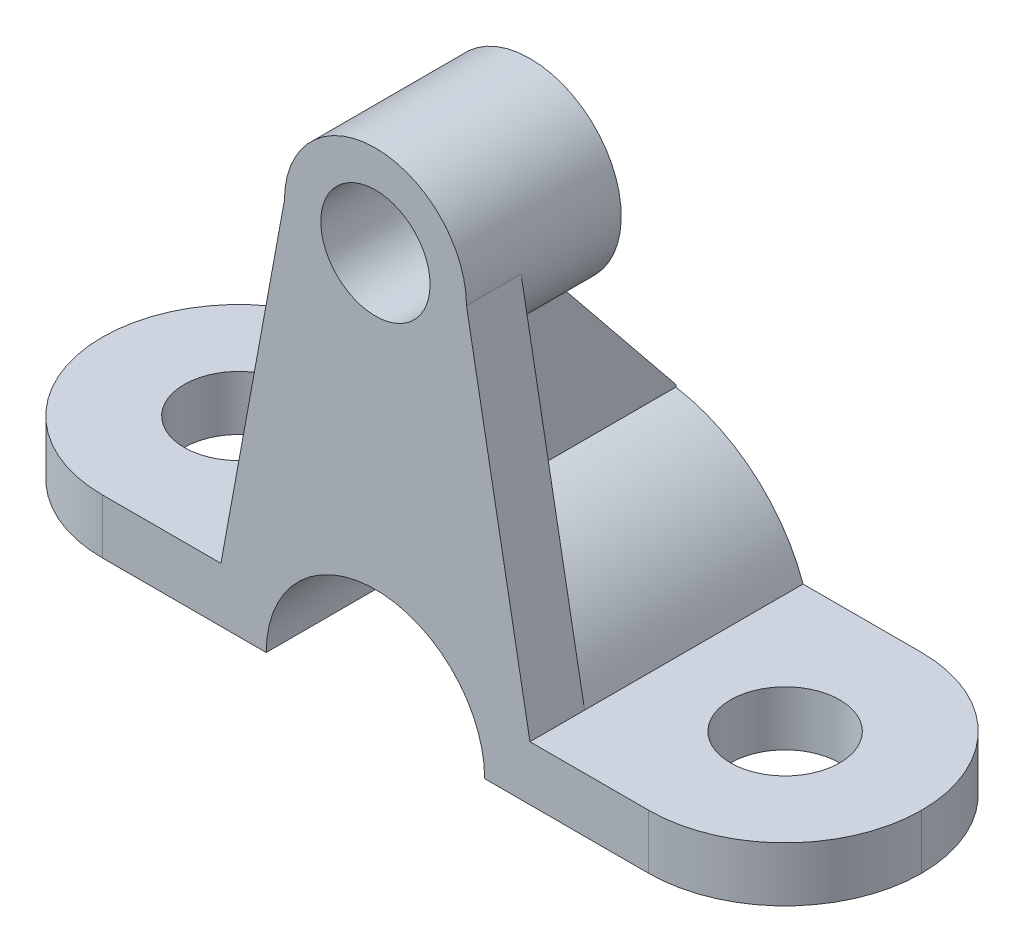
ISO-10303-21;
HEADER;
FILE_DESCRIPTION(('STEP AP214'),'2;1');
FILE_NAME('part.step','',(''),(''),'','','');
FILE_SCHEMA(('AUTOMOTIVE_DESIGN { 1 0 10303 214 1 1 1 1 }'));
ENDSEC;
DATA;
#1=APPLICATION_CONTEXT('core data for automotive mechanical design processes');
#2=APPLICATION_PROTOCOL_DEFINITION('international standard','automotive_design',2000,#1);
#3=PRODUCT_CONTEXT('',#1,'mechanical');
#4=PRODUCT('Part','Part','',(#3));
#5=PRODUCT_RELATED_PRODUCT_CATEGORY('part','',(#4));
#6=PRODUCT_DEFINITION_FORMATION('','',#4);
#7=PRODUCT_DEFINITION_CONTEXT('part definition',#1,'design');
#8=PRODUCT_DEFINITION('design','',#6,#7);
#9=PRODUCT_DEFINITION_SHAPE('','',#8);
#10=(LENGTH_UNIT() NAMED_UNIT(*) SI_UNIT(.MILLI.,.METRE.));
#11=(NAMED_UNIT(*) PLANE_ANGLE_UNIT() SI_UNIT($,.RADIAN.));
#12=(NAMED_UNIT(*) SI_UNIT($,.STERADIAN.) SOLID_ANGLE_UNIT());
#13=UNCERTAINTY_MEASURE_WITH_UNIT(LENGTH_MEASURE(1.E-05),#10,'distance_accuracy_value','');
#14=(GEOMETRIC_REPRESENTATION_CONTEXT(3) GLOBAL_UNCERTAINTY_ASSIGNED_CONTEXT((#13)) GLOBAL_UNIT_ASSIGNED_CONTEXT((#10,
#11,#12)) REPRESENTATION_CONTEXT('',''));
#15=CARTESIAN_POINT('',(0.,0.,0.));
#16=DIRECTION('',(0.,0.,1.));
#17=DIRECTION('',(1.,0.,0.));
#18=AXIS2_PLACEMENT_3D('',#15,#16,#17);
#19=CARTESIAN_POINT('',(0.,0.,30.));
#20=DIRECTION('',(0.,0.,-1.));
#21=DIRECTION('',(-1.,0.,0.));
#22=AXIS2_PLACEMENT_3D('',#19,#20,#21);
#23=CYLINDRICAL_SURFACE('',#22,36.);
#24=DIRECTION('',(0.,0.,-1.));
#25=VECTOR('',#24,1.);
#26=CARTESIAN_POINT('',(-6.,35.4964786985977,30.));
#27=LINE('',#26,#25);
#28=CARTESIAN_POINT('',(-6.,35.4964786985977,-30.));
#29=VERTEX_POINT('',#28);
#30=CARTESIAN_POINT('',(-6.,35.4964786985977,18.));
#31=VERTEX_POINT('',#30);
#32=EDGE_CURVE('E60',#29,#31,#27,.F.);
#33=ORIENTED_EDGE('',*,*,#32,.F.);
#34=CARTESIAN_POINT('',(0.,0.,-30.));
#35=DIRECTION('',(0.,0.,1.));
#36=DIRECTION('',(1.,0.,0.));
#37=AXIS2_PLACEMENT_3D('',#34,#35,#36);
#38=CIRCLE('',#37,36.);
#39=CARTESIAN_POINT('',(-33.9411254969543,12.,-30.));
#40=VERTEX_POINT('',#39);
#41=EDGE_CURVE('E322',#29,#40,#38,.T.);
#42=ORIENTED_EDGE('',*,*,#41,.T.);
#43=DIRECTION('',(0.,0.,-1.));
#44=VECTOR('',#43,1.);
#45=CARTESIAN_POINT('',(-33.9411254969543,12.,30.));
#46=LINE('',#45,#44);
#47=CARTESIAN_POINT('',(-33.9411254969543,12.,18.));
#48=VERTEX_POINT('',#47);
#49=EDGE_CURVE('E308',#48,#40,#46,.T.);
#50=ORIENTED_EDGE('',*,*,#49,.F.);
#51=CARTESIAN_POINT('',(0.,0.,18.));
#52=DIRECTION('',(0.,0.,-1.));
#53=DIRECTION('',(1.,0.,0.));
#54=AXIS2_PLACEMENT_3D('',#51,#52,#53);
#55=CIRCLE('',#54,36.);
#56=EDGE_CURVE('E242',#48,#31,#55,.T.);
#57=ORIENTED_EDGE('',*,*,#56,.T.);
#58=EDGE_LOOP('',(#33,#42,#50,#57));
#59=FACE_BOUND('',#58,.T.);
#60=ADVANCED_FACE('F43',(#59),#23,.T.);
#61=CARTESIAN_POINT('',(0.,0.,18.));
#62=DIRECTION('',(0.,0.,1.));
#63=DIRECTION('',(1.,0.,0.));
#64=AXIS2_PLACEMENT_3D('',#61,#62,#63);
#65=PLANE('',#64);
#66=DIRECTION('',(0.,1.,0.));
#67=VECTOR('',#66,1.);
#68=CARTESIAN_POINT('',(-6.,0.,18.));
#69=LINE('',#68,#67);
#70=CARTESIAN_POINT('',(-6.,68.9212159716611,18.));
#71=VERTEX_POINT('',#70);
#72=EDGE_CURVE('E211',#31,#71,#69,.T.);
#73=ORIENTED_EDGE('',*,*,#72,.F.);
#74=ORIENTED_EDGE('',*,*,#56,.F.);
#75=DIRECTION('',(-0.180425434485843,-0.98358866534268,0.));
#76=VECTOR('',#75,1.);
#77=CARTESIAN_POINT('',(-33.9411254969543,12.,18.));
#78=LINE('',#77,#76);
#79=CARTESIAN_POINT('',(-20.,88.,18.));
#80=VERTEX_POINT('',#79);
#81=EDGE_CURVE('E255',#80,#48,#78,.T.);
#82=ORIENTED_EDGE('',*,*,#81,.F.);
#83=CARTESIAN_POINT('',(0.,88.,18.));
#84=DIRECTION('',(0.,0.,-1.));
#85=DIRECTION('',(1.,0.,0.));
#86=AXIS2_PLACEMENT_3D('',#83,#84,#85);
#87=CIRCLE('',#86,20.);
#88=EDGE_CURVE('E250',#71,#80,#87,.T.);
#89=ORIENTED_EDGE('',*,*,#88,.F.);
#90=EDGE_LOOP('',(#73,#74,#82,#89));
#91=FACE_BOUND('',#90,.T.);
#92=ADVANCED_FACE('F439',(#91),#65,.F.);
#93=CARTESIAN_POINT('',(33.9411254969543,12.,-30.));
#94=VERTEX_POINT('',#93);
#95=CARTESIAN_POINT('',(6.,35.4964786985977,-30.));
#96=VERTEX_POINT('',#95);
#97=EDGE_CURVE('E68',#94,#96,#38,.T.);
#98=ORIENTED_EDGE('',*,*,#97,.T.);
#99=DIRECTION('',(0.,0.,-1.));
#100=VECTOR('',#99,1.);
#101=CARTESIAN_POINT('',(6.,35.4964786985977,30.));
#102=LINE('',#101,#100);
#103=CARTESIAN_POINT('',(6.,35.4964786985977,18.));
#104=VERTEX_POINT('',#103);
#105=EDGE_CURVE('E178',#96,#104,#102,.F.);
#106=ORIENTED_EDGE('',*,*,#105,.T.);
#107=CARTESIAN_POINT('',(33.9411254969543,12.,18.));
#108=VERTEX_POINT('',#107);
#109=EDGE_CURVE('E246',#104,#108,#55,.T.);
#110=ORIENTED_EDGE('',*,*,#109,.T.);
#111=DIRECTION('',(0.,0.,-1.));
#112=VECTOR('',#111,1.);
#113=CARTESIAN_POINT('',(33.9411254969543,12.,30.));
#114=LINE('',#113,#112);
#115=EDGE_CURVE('E332',#108,#94,#114,.T.);
#116=ORIENTED_EDGE('',*,*,#115,.T.);
#117=EDGE_LOOP('',(#98,#106,#110,#116));
#118=FACE_BOUND('',#117,.T.);
#119=ADVANCED_FACE('F437',(#118),#23,.T.);
#120=CARTESIAN_POINT('',(-60.,12.,0.));
#121=DIRECTION('',(0.,-1.,0.));
#122=DIRECTION('',(0.,0.,-1.));
#123=AXIS2_PLACEMENT_3D('',#120,#121,#122);
#124=CYLINDRICAL_SURFACE('',#123,30.);
#125=DIRECTION('',(0.,-1.,0.));
#126=VECTOR('',#125,1.);
#127=CARTESIAN_POINT('',(-60.,0.,30.));
#128=LINE('',#127,#126);
#129=CARTESIAN_POINT('',(-60.,12.,30.));
#130=VERTEX_POINT('',#129);
#131=CARTESIAN_POINT('',(-60.,0.,30.));
#132=VERTEX_POINT('',#131);
#133=EDGE_CURVE('E370',#130,#132,#128,.T.);
#134=ORIENTED_EDGE('',*,*,#133,.F.);
#135=CARTESIAN_POINT('',(-60.,12.,0.));
#136=DIRECTION('',(0.,-1.,0.));
#137=DIRECTION('',(1.,0.,0.));
#138=AXIS2_PLACEMENT_3D('',#135,#136,#137);
#139=CIRCLE('',#138,30.);
#140=CARTESIAN_POINT('',(-60.,12.,-30.));
#141=VERTEX_POINT('',#140);
#142=EDGE_CURVE('E378',#141,#130,#139,.F.);
#143=ORIENTED_EDGE('',*,*,#142,.F.);
#144=DIRECTION('',(0.,1.,0.));
#145=VECTOR('',#144,1.);
#146=CARTESIAN_POINT('',(-60.,12.,-30.));
#147=LINE('',#146,#145);
#148=CARTESIAN_POINT('',(-60.,0.,-30.));
#149=VERTEX_POINT('',#148);
#150=EDGE_CURVE('E374',#149,#141,#147,.T.);
#151=ORIENTED_EDGE('',*,*,#150,.F.);
#152=CARTESIAN_POINT('',(-60.,0.,0.));
#153=DIRECTION('',(0.,1.,0.));
#154=DIRECTION('',(0.,0.,1.));
#155=AXIS2_PLACEMENT_3D('',#152,#153,#154);
#156=CIRCLE('',#155,30.);
#157=EDGE_CURVE('E53',#132,#149,#156,.F.);
#158=ORIENTED_EDGE('',*,*,#157,.F.);
#159=EDGE_LOOP('',(#134,#143,#151,#158));
#160=FACE_BOUND('',#159,.T.);
#161=ADVANCED_FACE('F46',(#160),#124,.T.);
#162=CARTESIAN_POINT('',(60.,0.,0.));
#163=DIRECTION('',(0.,-1.,0.));
#164=DIRECTION('',(0.,0.,-1.));
#165=AXIS2_PLACEMENT_3D('',#162,#163,#164);
#166=CYLINDRICAL_SURFACE('',#165,30.);
#167=DIRECTION('',(0.,1.,0.));
#168=VECTOR('',#167,1.);
#169=CARTESIAN_POINT('',(90.,0.,0.));
#170=LINE('',#169,#168);
#171=CARTESIAN_POINT('',(90.,0.,0.));
#172=VERTEX_POINT('',#171);
#173=CARTESIAN_POINT('',(90.,12.,0.));
#174=VERTEX_POINT('',#173);
#175=EDGE_CURVE('E345',#172,#174,#170,.T.);
#176=ORIENTED_EDGE('',*,*,#175,.T.);
#177=CARTESIAN_POINT('',(60.,12.,0.));
#178=DIRECTION('',(0.,-1.,0.));
#179=DIRECTION('',(1.,0.,0.));
#180=AXIS2_PLACEMENT_3D('',#177,#178,#179);
#181=CIRCLE('',#180,30.);
#182=CARTESIAN_POINT('',(60.,12.,30.));
#183=VERTEX_POINT('',#182);
#184=EDGE_CURVE('E364',#183,#174,#181,.F.);
#185=ORIENTED_EDGE('',*,*,#184,.F.);
#186=DIRECTION('',(0.,-1.,0.));
#187=VECTOR('',#186,1.);
#188=CARTESIAN_POINT('',(60.,0.,30.));
#189=LINE('',#188,#187);
#190=CARTESIAN_POINT('',(60.,0.,30.));
#191=VERTEX_POINT('',#190);
#192=EDGE_CURVE('E360',#191,#183,#189,.F.);
#193=ORIENTED_EDGE('',*,*,#192,.F.);
#194=CARTESIAN_POINT('',(60.,0.,0.));
#195=DIRECTION('',(0.,1.,0.));
#196=DIRECTION('',(0.,0.,1.));
#197=AXIS2_PLACEMENT_3D('',#194,#195,#196);
#198=CIRCLE('',#197,30.);
#199=EDGE_CURVE('E367',#172,#191,#198,.F.);
#200=ORIENTED_EDGE('',*,*,#199,.F.);
#201=EDGE_LOOP('',(#176,#185,#193,#200));
#202=FACE_BOUND('',#201,.T.);
#203=ADVANCED_FACE('F446',(#202),#166,.T.);
#204=CARTESIAN_POINT('',(60.,0.,0.));
#205=DIRECTION('',(0.,-1.,0.));
#206=DIRECTION('',(0.,0.,-1.));
#207=AXIS2_PLACEMENT_3D('',#204,#205,#206);
#208=CYLINDRICAL_SURFACE('',#207,30.);
#209=ORIENTED_EDGE('',*,*,#175,.F.);
#210=CARTESIAN_POINT('',(60.,0.,0.));
#211=DIRECTION('',(0.,1.,0.));
#212=DIRECTION('',(0.,0.,1.));
#213=AXIS2_PLACEMENT_3D('',#210,#211,#212);
#214=CIRCLE('',#213,30.);
#215=CARTESIAN_POINT('',(60.,0.,-30.));
#216=VERTEX_POINT('',#215);
#217=EDGE_CURVE('E353',#216,#172,#214,.F.);
#218=ORIENTED_EDGE('',*,*,#217,.F.);
#219=DIRECTION('',(0.,1.,0.));
#220=VECTOR('',#219,1.);
#221=CARTESIAN_POINT('',(60.,0.,-30.));
#222=LINE('',#221,#220);
#223=CARTESIAN_POINT('',(60.,12.,-30.));
#224=VERTEX_POINT('',#223);
#225=EDGE_CURVE('E349',#224,#216,#222,.F.);
#226=ORIENTED_EDGE('',*,*,#225,.F.);
#227=CARTESIAN_POINT('',(60.,12.,0.));
#228=DIRECTION('',(0.,-1.,0.));
#229=DIRECTION('',(1.,0.,0.));
#230=AXIS2_PLACEMENT_3D('',#227,#228,#229);
#231=CIRCLE('',#230,30.);
#232=EDGE_CURVE('E357',#174,#224,#231,.F.);
#233=ORIENTED_EDGE('',*,*,#232,.F.);
#234=EDGE_LOOP('',(#209,#218,#226,#233));
#235=FACE_BOUND('',#234,.T.);
#236=ADVANCED_FACE('F583',(#235),#208,.T.);
#237=CARTESIAN_POINT('',(-90.,0.,30.));
#238=DIRECTION('',(0.,1.,0.));
#239=DIRECTION('',(0.,0.,1.));
#240=AXIS2_PLACEMENT_3D('',#237,#238,#239);
#241=PLANE('',#240);
#242=CARTESIAN_POINT('',(-60.,0.,0.));
#243=DIRECTION('',(0.,1.,0.));
#244=DIRECTION('',(-1.,0.,0.));
#245=AXIS2_PLACEMENT_3D('',#242,#243,#244);
#246=CIRCLE('',#245,12.);
#247=CARTESIAN_POINT('',(-72.,0.,0.));
#248=VERTEX_POINT('',#247);
#249=EDGE_CURVE('E273',#248,#248,#246,.T.);
#250=ORIENTED_EDGE('',*,*,#249,.T.);
#251=EDGE_LOOP('',(#250));
#252=FACE_BOUND('',#251,.T.);
#253=DIRECTION('',(1.,0.,0.));
#254=VECTOR('',#253,1.);
#255=CARTESIAN_POINT('',(-90.,0.,30.));
#256=LINE('',#255,#254);
#257=CARTESIAN_POINT('',(-24.,0.,30.));
#258=VERTEX_POINT('',#257);
#259=EDGE_CURVE('E289',#132,#258,#256,.T.);
#260=ORIENTED_EDGE('',*,*,#259,.F.);
#261=ORIENTED_EDGE('',*,*,#157,.T.);
#262=DIRECTION('',(1.,0.,0.));
#263=VECTOR('',#262,1.);
#264=CARTESIAN_POINT('',(-90.,0.,-30.));
#265=LINE('',#264,#263);
#266=CARTESIAN_POINT('',(-24.,0.,-30.));
#267=VERTEX_POINT('',#266);
#268=EDGE_CURVE('E285',#149,#267,#265,.T.);
#269=ORIENTED_EDGE('',*,*,#268,.T.);
#270=DIRECTION('',(0.,0.,-1.));
#271=VECTOR('',#270,1.);
#272=CARTESIAN_POINT('',(-24.,0.,30.));
#273=LINE('',#272,#271);
#274=EDGE_CURVE('E341',#258,#267,#273,.T.);
#275=ORIENTED_EDGE('',*,*,#274,.F.);
#276=EDGE_LOOP('',(#260,#261,#269,#275));
#277=FACE_BOUND('',#276,.T.);
#278=ADVANCED_FACE('F384',(#252,#277),#241,.F.);
#279=CARTESIAN_POINT('',(0.,0.,30.));
#280=DIRECTION('',(0.,0.,-1.));
#281=DIRECTION('',(-1.,0.,0.));
#282=AXIS2_PLACEMENT_3D('',#279,#280,#281);
#283=CYLINDRICAL_SURFACE('',#282,24.);
#284=CARTESIAN_POINT('',(0.,0.,-30.));
#285=DIRECTION('',(0.,0.,-1.));
#286=DIRECTION('',(-1.,0.,0.));
#287=AXIS2_PLACEMENT_3D('',#284,#285,#286);
#288=CIRCLE('',#287,24.);
#289=CARTESIAN_POINT('',(24.,0.,-30.));
#290=VERTEX_POINT('',#289);
#291=EDGE_CURVE('E311',#267,#290,#288,.T.);
#292=ORIENTED_EDGE('',*,*,#291,.T.);
#293=DIRECTION('',(0.,0.,-1.));
#294=VECTOR('',#293,1.);
#295=CARTESIAN_POINT('',(24.,0.,30.));
#296=LINE('',#295,#294);
#297=CARTESIAN_POINT('',(24.,0.,30.));
#298=VERTEX_POINT('',#297);
#299=EDGE_CURVE('E337',#298,#290,#296,.T.);
#300=ORIENTED_EDGE('',*,*,#299,.F.);
#301=CARTESIAN_POINT('',(0.,0.,30.));
#302=DIRECTION('',(0.,0.,-1.));
#303=DIRECTION('',(-1.,0.,0.));
#304=AXIS2_PLACEMENT_3D('',#301,#302,#303);
#305=CIRCLE('',#304,24.);
#306=EDGE_CURVE('E292',#258,#298,#305,.T.);
#307=ORIENTED_EDGE('',*,*,#306,.F.);
#308=ORIENTED_EDGE('',*,*,#274,.T.);
#309=EDGE_LOOP('',(#292,#300,#307,#308));
#310=FACE_BOUND('',#309,.T.);
#311=ADVANCED_FACE('F394',(#310),#283,.F.);
#312=CARTESIAN_POINT('',(24.,0.,30.));
#313=DIRECTION('',(0.,1.,0.));
#314=DIRECTION('',(0.,0.,1.));
#315=AXIS2_PLACEMENT_3D('',#312,#313,#314);
#316=PLANE('',#315);
#317=CARTESIAN_POINT('',(60.,0.,0.));
#318=DIRECTION('',(0.,1.,0.));
#319=DIRECTION('',(-1.,0.,0.));
#320=AXIS2_PLACEMENT_3D('',#317,#318,#319);
#321=CIRCLE('',#320,12.);
#322=CARTESIAN_POINT('',(48.,0.,0.));
#323=VERTEX_POINT('',#322);
#324=EDGE_CURVE('E281',#323,#323,#321,.T.);
#325=ORIENTED_EDGE('',*,*,#324,.T.);
#326=EDGE_LOOP('',(#325));
#327=FACE_BOUND('',#326,.T.);
#328=ORIENTED_EDGE('',*,*,#217,.T.);
#329=ORIENTED_EDGE('',*,*,#199,.T.);
#330=DIRECTION('',(1.,0.,0.));
#331=VECTOR('',#330,1.);
#332=CARTESIAN_POINT('',(24.,0.,30.));
#333=LINE('',#332,#331);
#334=EDGE_CURVE('E296',#298,#191,#333,.T.);
#335=ORIENTED_EDGE('',*,*,#334,.F.);
#336=ORIENTED_EDGE('',*,*,#299,.T.);
#337=DIRECTION('',(1.,0.,0.));
#338=VECTOR('',#337,1.);
#339=CARTESIAN_POINT('',(24.,0.,-30.));
#340=LINE('',#339,#338);
#341=EDGE_CURVE('E314',#290,#216,#340,.T.);
#342=ORIENTED_EDGE('',*,*,#341,.T.);
#343=EDGE_LOOP('',(#328,#329,#335,#336,#342));
#344=FACE_BOUND('',#343,.T.);
#345=ADVANCED_FACE('F398',(#327,#344),#316,.F.);
#346=CARTESIAN_POINT('',(90.,12.,30.));
#347=DIRECTION('',(0.,-1.,0.));
#348=DIRECTION('',(1.,0.,0.));
#349=AXIS2_PLACEMENT_3D('',#346,#347,#348);
#350=PLANE('',#349);
#351=CARTESIAN_POINT('',(60.,12.,0.));
#352=DIRECTION('',(0.,1.,0.));
#353=DIRECTION('',(-1.,0.,0.));
#354=AXIS2_PLACEMENT_3D('',#351,#352,#353);
#355=CIRCLE('',#354,12.);
#356=CARTESIAN_POINT('',(48.,12.,0.));
#357=VERTEX_POINT('',#356);
#358=EDGE_CURVE('E277',#357,#357,#355,.T.);
#359=ORIENTED_EDGE('',*,*,#358,.F.);
#360=EDGE_LOOP('',(#359));
#361=FACE_BOUND('',#360,.T.);
#362=DIRECTION('',(-1.,0.,0.));
#363=VECTOR('',#362,1.);
#364=CARTESIAN_POINT('',(90.,12.,30.));
#365=LINE('',#364,#363);
#366=CARTESIAN_POINT('',(33.9411254969543,12.,30.));
#367=VERTEX_POINT('',#366);
#368=EDGE_CURVE('E300',#183,#367,#365,.T.);
#369=ORIENTED_EDGE('',*,*,#368,.F.);
#370=ORIENTED_EDGE('',*,*,#184,.T.);
#371=ORIENTED_EDGE('',*,*,#232,.T.);
#372=DIRECTION('',(-1.,0.,0.));
#373=VECTOR('',#372,1.);
#374=CARTESIAN_POINT('',(90.,12.,-30.));
#375=LINE('',#374,#373);
#376=EDGE_CURVE('E318',#224,#94,#375,.T.);
#377=ORIENTED_EDGE('',*,*,#376,.T.);
#378=ORIENTED_EDGE('',*,*,#115,.F.);
#379=EDGE_CURVE('E333',#367,#108,#114,.T.);
#380=ORIENTED_EDGE('',*,*,#379,.F.);
#381=EDGE_LOOP('',(#369,#370,#371,#377,#378,#380));
#382=FACE_BOUND('',#381,.T.);
#383=ADVANCED_FACE('F431',(#361,#382),#350,.F.);
#384=CARTESIAN_POINT('',(-33.9411254969543,12.,30.));
#385=DIRECTION('',(0.,-1.,0.));
#386=DIRECTION('',(1.,0.,0.));
#387=AXIS2_PLACEMENT_3D('',#384,#385,#386);
#388=PLANE('',#387);
#389=CARTESIAN_POINT('',(-60.,12.,0.));
#390=DIRECTION('',(0.,1.,0.));
#391=DIRECTION('',(-1.,0.,0.));
#392=AXIS2_PLACEMENT_3D('',#389,#390,#391);
#393=CIRCLE('',#392,12.);
#394=CARTESIAN_POINT('',(-72.,12.,0.));
#395=VERTEX_POINT('',#394);
#396=EDGE_CURVE('E270',#395,#395,#393,.T.);
#397=ORIENTED_EDGE('',*,*,#396,.F.);
#398=EDGE_LOOP('',(#397));
#399=FACE_BOUND('',#398,.T.);
#400=DIRECTION('',(-1.,0.,0.));
#401=VECTOR('',#400,1.);
#402=CARTESIAN_POINT('',(-33.9411254969543,12.,-30.));
#403=LINE('',#402,#401);
#404=EDGE_CURVE('E293',#40,#141,#403,.T.);
#405=ORIENTED_EDGE('',*,*,#404,.T.);
#406=ORIENTED_EDGE('',*,*,#142,.T.);
#407=DIRECTION('',(-1.,0.,0.));
#408=VECTOR('',#407,1.);
#409=CARTESIAN_POINT('',(-33.9411254969543,12.,30.));
#410=LINE('',#409,#408);
#411=CARTESIAN_POINT('',(-33.9411254969543,12.,30.));
#412=VERTEX_POINT('',#411);
#413=EDGE_CURVE('E304',#412,#130,#410,.T.);
#414=ORIENTED_EDGE('',*,*,#413,.F.);
#415=EDGE_CURVE('E328',#412,#48,#46,.T.);
#416=ORIENTED_EDGE('',*,*,#415,.T.);
#417=ORIENTED_EDGE('',*,*,#49,.T.);
#418=EDGE_LOOP('',(#405,#406,#414,#416,#417));
#419=FACE_BOUND('',#418,.T.);
#420=ADVANCED_FACE('F407',(#399,#419),#388,.F.);
#421=CARTESIAN_POINT('',(0.,0.,30.));
#422=DIRECTION('',(0.,0.,-1.));
#423=DIRECTION('',(-1.,0.,0.));
#424=AXIS2_PLACEMENT_3D('',#421,#422,#423);
#425=PLANE('',#424);
#426=ORIENTED_EDGE('',*,*,#413,.T.);
#427=ORIENTED_EDGE('',*,*,#133,.T.);
#428=ORIENTED_EDGE('',*,*,#259,.T.);
#429=ORIENTED_EDGE('',*,*,#306,.T.);
#430=ORIENTED_EDGE('',*,*,#334,.T.);
#431=ORIENTED_EDGE('',*,*,#192,.T.);
#432=ORIENTED_EDGE('',*,*,#368,.T.);
#433=DIRECTION('',(-0.180425434485843,0.98358866534268,0.));
#434=VECTOR('',#433,1.);
#435=CARTESIAN_POINT('',(33.9411254969543,12.,30.));
#436=LINE('',#435,#434);
#437=CARTESIAN_POINT('',(20.,88.,30.));
#438=VERTEX_POINT('',#437);
#439=EDGE_CURVE('E238',#367,#438,#436,.T.);
#440=ORIENTED_EDGE('',*,*,#439,.T.);
#441=CARTESIAN_POINT('',(0.,88.,30.));
#442=DIRECTION('',(0.,0.,1.));
#443=DIRECTION('',(1.,0.,0.));
#444=AXIS2_PLACEMENT_3D('',#441,#442,#443);
#445=CIRCLE('',#444,20.);
#446=CARTESIAN_POINT('',(-20.,88.,30.));
#447=VERTEX_POINT('',#446);
#448=EDGE_CURVE('E231',#438,#447,#445,.T.);
#449=ORIENTED_EDGE('',*,*,#448,.T.);
#450=DIRECTION('',(-0.180425434485843,-0.98358866534268,0.));
#451=VECTOR('',#450,1.);
#452=CARTESIAN_POINT('',(-33.9411254969543,12.,30.));
#453=LINE('',#452,#451);
#454=EDGE_CURVE('E263',#447,#412,#453,.T.);
#455=ORIENTED_EDGE('',*,*,#454,.T.);
#456=EDGE_LOOP('',(#426,#427,#428,#429,#430,#431,#432,#440,#449,#455));
#457=FACE_BOUND('',#456,.T.);
#458=CARTESIAN_POINT('',(0.,88.,30.));
#459=DIRECTION('',(0.,0.,1.));
#460=DIRECTION('',(1.,0.,0.));
#461=AXIS2_PLACEMENT_3D('',#458,#459,#460);
#462=CIRCLE('',#461,12.);
#463=CARTESIAN_POINT('',(12.,88.,30.));
#464=VERTEX_POINT('',#463);
#465=EDGE_CURVE('E226',#464,#464,#462,.T.);
#466=ORIENTED_EDGE('',*,*,#465,.F.);
#467=EDGE_LOOP('',(#466));
#468=FACE_BOUND('',#467,.T.);
#469=ADVANCED_FACE('F401',(#457,#468),#425,.F.);
#470=CARTESIAN_POINT('',(0.,0.,-30.));
#471=DIRECTION('',(0.,0.,-1.));
#472=DIRECTION('',(-1.,0.,0.));
#473=AXIS2_PLACEMENT_3D('',#470,#471,#472);
#474=PLANE('',#473);
#475=DIRECTION('',(0.,1.,0.));
#476=VECTOR('',#475,1.);
#477=CARTESIAN_POINT('',(-6.,0.,-30.));
#478=LINE('',#477,#476);
#479=CARTESIAN_POINT('',(-6.,36.,-30.));
#480=VERTEX_POINT('',#479);
#481=EDGE_CURVE('E187',#29,#480,#478,.T.);
#482=ORIENTED_EDGE('',*,*,#481,.T.);
#483=DIRECTION('',(-1.,0.,0.));
#484=VECTOR('',#483,1.);
#485=CARTESIAN_POINT('',(6.,36.,-30.));
#486=LINE('',#485,#484);
#487=CARTESIAN_POINT('',(6.,36.,-30.));
#488=VERTEX_POINT('',#487);
#489=EDGE_CURVE('E184',#488,#480,#486,.T.);
#490=ORIENTED_EDGE('',*,*,#489,.F.);
#491=DIRECTION('',(0.,1.,0.));
#492=VECTOR('',#491,1.);
#493=CARTESIAN_POINT('',(6.,0.,-30.));
#494=LINE('',#493,#492);
#495=EDGE_CURVE('E170',#96,#488,#494,.T.);
#496=ORIENTED_EDGE('',*,*,#495,.F.);
#497=ORIENTED_EDGE('',*,*,#97,.F.);
#498=ORIENTED_EDGE('',*,*,#376,.F.);
#499=ORIENTED_EDGE('',*,*,#225,.T.);
#500=ORIENTED_EDGE('',*,*,#341,.F.);
#501=ORIENTED_EDGE('',*,*,#291,.F.);
#502=ORIENTED_EDGE('',*,*,#268,.F.);
#503=ORIENTED_EDGE('',*,*,#150,.T.);
#504=ORIENTED_EDGE('',*,*,#404,.F.);
#505=ORIENTED_EDGE('',*,*,#41,.F.);
#506=EDGE_LOOP('',(#482,#490,#496,#497,#498,#499,#500,#501,#502,#503,#504,#505));
#507=FACE_BOUND('',#506,.T.);
#508=ADVANCED_FACE('F185',(#507),#474,.T.);
#509=CARTESIAN_POINT('',(60.,0.,0.));
#510=DIRECTION('',(0.,1.,0.));
#511=DIRECTION('',(-1.,0.,0.));
#512=AXIS2_PLACEMENT_3D('',#509,#510,#511);
#513=CYLINDRICAL_SURFACE('',#512,12.);
#514=CARTESIAN_POINT('',(48.,0.,0.));
#515=CARTESIAN_POINT('',(48.,0.124999999999962,0.));
#516=CARTESIAN_POINT('',(48.,0.249999999999963,0.));
#517=CARTESIAN_POINT('',(48.,0.499999999999964,0.));
#518=CARTESIAN_POINT('',(48.,0.624999999999964,0.));
#519=CARTESIAN_POINT('',(48.,0.874999999999965,0.));
#520=CARTESIAN_POINT('',(48.,0.999999999999966,0.));
#521=CARTESIAN_POINT('',(48.,1.24999999999997,0.));
#522=CARTESIAN_POINT('',(48.,1.37499999999997,0.));
#523=CARTESIAN_POINT('',(48.,1.62499999999997,0.));
#524=CARTESIAN_POINT('',(48.,1.74999999999997,0.));
#525=CARTESIAN_POINT('',(48.,1.99999999999997,0.));
#526=CARTESIAN_POINT('',(48.,2.12499999999997,0.));
#527=CARTESIAN_POINT('',(48.,2.37499999999997,0.));
#528=CARTESIAN_POINT('',(48.,2.49999999999997,0.));
#529=CARTESIAN_POINT('',(48.,2.74999999999997,0.));
#530=CARTESIAN_POINT('',(48.,2.87499999999997,0.));
#531=CARTESIAN_POINT('',(48.,3.12499999999997,0.));
#532=CARTESIAN_POINT('',(48.,3.24999999999997,0.));
#533=CARTESIAN_POINT('',(48.,3.49999999999998,0.));
#534=CARTESIAN_POINT('',(48.,3.62499999999998,0.));
#535=CARTESIAN_POINT('',(48.,3.87499999999998,0.));
#536=CARTESIAN_POINT('',(48.,3.99999999999998,0.));
#537=CARTESIAN_POINT('',(48.,4.24999999999998,0.));
#538=CARTESIAN_POINT('',(48.,4.37499999999998,0.));
#539=CARTESIAN_POINT('',(48.,4.62499999999998,0.));
#540=CARTESIAN_POINT('',(48.,4.74999999999998,0.));
#541=CARTESIAN_POINT('',(48.,4.99999999999998,0.));
#542=CARTESIAN_POINT('',(48.,5.12499999999998,0.));
#543=CARTESIAN_POINT('',(48.,5.37499999999998,0.));
#544=CARTESIAN_POINT('',(48.,5.49999999999998,0.));
#545=CARTESIAN_POINT('',(48.,5.74999999999998,0.));
#546=CARTESIAN_POINT('',(48.,5.87499999999998,0.));
#547=CARTESIAN_POINT('',(48.,6.12499999999999,0.));
#548=CARTESIAN_POINT('',(48.,6.24999999999999,0.));
#549=CARTESIAN_POINT('',(48.,6.49999999999999,0.));
#550=CARTESIAN_POINT('',(48.,6.62499999999999,0.));
#551=CARTESIAN_POINT('',(48.,6.87499999999999,0.));
#552=CARTESIAN_POINT('',(48.,6.99999999999999,0.));
#553=CARTESIAN_POINT('',(48.,7.24999999999999,0.));
#554=CARTESIAN_POINT('',(48.,7.37499999999999,0.));
#555=CARTESIAN_POINT('',(48.,7.62499999999999,0.));
#556=CARTESIAN_POINT('',(48.,7.74999999999999,0.));
#557=CARTESIAN_POINT('',(48.,7.99999999999999,0.));
#558=CARTESIAN_POINT('',(48.,8.12499999999999,0.));
#559=CARTESIAN_POINT('',(48.,8.37499999999999,0.));
#560=CARTESIAN_POINT('',(48.,8.49999999999999,0.));
#561=CARTESIAN_POINT('',(48.,8.75,0.));
#562=CARTESIAN_POINT('',(48.,8.875,0.));
#563=CARTESIAN_POINT('',(48.,9.125,0.));
#564=CARTESIAN_POINT('',(48.,9.25,0.));
#565=CARTESIAN_POINT('',(48.,9.5,0.));
#566=CARTESIAN_POINT('',(48.,9.625,0.));
#567=CARTESIAN_POINT('',(48.,9.875,0.));
#568=CARTESIAN_POINT('',(48.,10.,0.));
#569=CARTESIAN_POINT('',(48.,10.25,0.));
#570=CARTESIAN_POINT('',(48.,10.375,0.));
#571=CARTESIAN_POINT('',(48.,10.625,0.));
#572=CARTESIAN_POINT('',(48.,10.75,0.));
#573=CARTESIAN_POINT('',(48.,11.,0.));
#574=CARTESIAN_POINT('',(48.,11.125,0.));
#575=CARTESIAN_POINT('',(48.,11.375,0.));
#576=CARTESIAN_POINT('',(48.,11.5,0.));
#577=CARTESIAN_POINT('',(48.,11.75,0.));
#578=CARTESIAN_POINT('',(48.,11.875,0.));
#579=CARTESIAN_POINT('',(48.,12.,0.));
#580=B_SPLINE_CURVE_WITH_KNOTS('',3,(#514,#515,#516,#517,#518,#519,#520,#521,#522,#523,#524,
#525,#526,#527,#528,#529,#530,#531,#532,#533,#534,#535,#536,#537,#538,#539,#540,#541,#542,#543,
#544,#545,#546,#547,#548,#549,#550,#551,#552,#553,#554,#555,#556,#557,#558,#559,#560,#561,#562,
#563,#564,#565,#566,#567,#568,#569,#570,#571,#572,#573,#574,#575,#576,#577,#578,#579),
.UNSPECIFIED.,.F.,.F.,(4,2,2,2,2,2,2,2,2,2,2,2,2,2,2,2,2,2,2,2,2,2,2,2,2,2,2,2,2,2,2,2,4),(0.,
0.375000000000001,0.750000000000003,1.125,1.50000000000001,1.87500000000001,2.25000000000001,
2.62500000000001,3.00000000000001,3.37500000000001,3.75000000000002,4.12500000000002,
4.50000000000002,4.87500000000002,5.25000000000002,5.62500000000002,6.00000000000002,
6.37500000000002,6.75000000000003,7.12500000000003,7.50000000000003,7.87500000000003,
8.25000000000003,8.62500000000003,9.00000000000003,9.37500000000004,9.75000000000004,10.125,
10.5,10.875,11.25,11.625,12.),.UNSPECIFIED.);
#581=EDGE_CURVE('BSEAM487',#323,#357,#580,.T.);
#582=ORIENTED_EDGE('',*,*,#324,.F.);
#583=ORIENTED_EDGE('',*,*,#358,.T.);
#584=ORIENTED_EDGE('',*,*,#581,.T.);
#585=ORIENTED_EDGE('',*,*,#581,.F.);
#586=EDGE_LOOP('',(#582,#584,#583,#585));
#587=FACE_BOUND('',#586,.T.);
#588=ADVANCED_FACE('F487',(#587),#513,.F.);
#589=CARTESIAN_POINT('',(-60.,0.,0.));
#590=DIRECTION('',(0.,1.,0.));
#591=DIRECTION('',(-1.,0.,0.));
#592=AXIS2_PLACEMENT_3D('',#589,#590,#591);
#593=CYLINDRICAL_SURFACE('',#592,12.);
#594=ORIENTED_EDGE('',*,*,#249,.F.);
#595=EDGE_LOOP('',(#594));
#596=FACE_BOUND('',#595,.T.);
#597=ORIENTED_EDGE('',*,*,#396,.T.);
#598=EDGE_LOOP('',(#597));
#599=FACE_BOUND('',#598,.T.);
#600=ADVANCED_FACE('F494',(#596,#599),#593,.F.);
#601=CARTESIAN_POINT('',(-33.9411254969543,12.,18.));
#602=DIRECTION('',(-0.98358866534268,0.180425434485843,0.));
#603=DIRECTION('',(-0.180425434485843,-0.98358866534268,0.));
#604=AXIS2_PLACEMENT_3D('',#601,#602,#603);
#605=PLANE('',#604);
#606=ORIENTED_EDGE('',*,*,#454,.F.);
#607=DIRECTION('',(0.,0.,1.));
#608=VECTOR('',#607,1.);
#609=CARTESIAN_POINT('',(-20.,88.,18.));
#610=LINE('',#609,#608);
#611=EDGE_CURVE('E266',#80,#447,#610,.T.);
#612=ORIENTED_EDGE('',*,*,#611,.F.);
#613=ORIENTED_EDGE('',*,*,#81,.T.);
#614=ORIENTED_EDGE('',*,*,#415,.F.);
#615=EDGE_LOOP('',(#606,#612,#613,#614));
#616=FACE_BOUND('',#615,.T.);
#617=ADVANCED_FACE('F503',(#616),#605,.T.);
#618=CARTESIAN_POINT('',(33.9411254969543,12.,18.));
#619=DIRECTION('',(0.98358866534268,0.180425434485843,0.));
#620=DIRECTION('',(-0.180425434485843,0.98358866534268,0.));
#621=AXIS2_PLACEMENT_3D('',#618,#619,#620);
#622=PLANE('',#621);
#623=ORIENTED_EDGE('',*,*,#439,.F.);
#624=ORIENTED_EDGE('',*,*,#379,.T.);
#625=DIRECTION('',(-0.180425434485843,0.98358866534268,0.));
#626=VECTOR('',#625,1.);
#627=CARTESIAN_POINT('',(33.9411254969543,12.,18.));
#628=LINE('',#627,#626);
#629=CARTESIAN_POINT('',(20.,88.,18.));
#630=VERTEX_POINT('',#629);
#631=EDGE_CURVE('E245',#108,#630,#628,.T.);
#632=ORIENTED_EDGE('',*,*,#631,.T.);
#633=DIRECTION('',(0.,0.,1.));
#634=VECTOR('',#633,1.);
#635=CARTESIAN_POINT('',(20.,88.,18.));
#636=LINE('',#635,#634);
#637=EDGE_CURVE('E259',#630,#438,#636,.T.);
#638=ORIENTED_EDGE('',*,*,#637,.T.);
#639=EDGE_LOOP('',(#623,#624,#632,#638));
#640=FACE_BOUND('',#639,.T.);
#641=ADVANCED_FACE('F428',(#640),#622,.T.);
#642=ORIENTED_EDGE('',*,*,#109,.F.);
#643=DIRECTION('',(0.,1.,0.));
#644=VECTOR('',#643,1.);
#645=CARTESIAN_POINT('',(6.,0.,18.));
#646=LINE('',#645,#644);
#647=CARTESIAN_POINT('',(6.,68.9212159716611,18.));
#648=VERTEX_POINT('',#647);
#649=EDGE_CURVE('E221',#104,#648,#646,.T.);
#650=ORIENTED_EDGE('',*,*,#649,.T.);
#651=EDGE_CURVE('E251',#630,#648,#87,.T.);
#652=ORIENTED_EDGE('',*,*,#651,.F.);
#653=ORIENTED_EDGE('',*,*,#631,.F.);
#654=EDGE_LOOP('',(#642,#650,#652,#653));
#655=FACE_BOUND('',#654,.T.);
#656=ADVANCED_FACE('F425',(#655),#65,.F.);
#657=CARTESIAN_POINT('',(0.,88.,-4.));
#658=DIRECTION('',(0.,0.,1.));
#659=DIRECTION('',(1.,0.,0.));
#660=AXIS2_PLACEMENT_3D('',#657,#658,#659);
#661=CYLINDRICAL_SURFACE('',#660,20.);
#662=DIRECTION('',(0.,0.,1.));
#663=VECTOR('',#662,1.);
#664=CARTESIAN_POINT('',(6.,68.9212159716611,-4.));
#665=LINE('',#664,#663);
#666=CARTESIAN_POINT('',(6.,68.9212159716611,-4.));
#667=VERTEX_POINT('',#666);
#668=EDGE_CURVE('E217',#667,#648,#665,.T.);
#669=ORIENTED_EDGE('',*,*,#668,.F.);
#670=CARTESIAN_POINT('',(0.,88.,-4.));
#671=DIRECTION('',(0.,0.,1.));
#672=DIRECTION('',(1.,0.,0.));
#673=AXIS2_PLACEMENT_3D('',#670,#671,#672);
#674=CIRCLE('',#673,20.);
#675=CARTESIAN_POINT('',(-6.,68.9212159716611,-4.));
#676=VERTEX_POINT('',#675);
#677=EDGE_CURVE('E235',#667,#676,#674,.T.);
#678=ORIENTED_EDGE('',*,*,#677,.T.);
#679=DIRECTION('',(0.,0.,1.));
#680=VECTOR('',#679,1.);
#681=CARTESIAN_POINT('',(-6.,68.9212159716611,-4.));
#682=LINE('',#681,#680);
#683=EDGE_CURVE('E192',#676,#71,#682,.T.);
#684=ORIENTED_EDGE('',*,*,#683,.T.);
#685=ORIENTED_EDGE('',*,*,#88,.T.);
#686=ORIENTED_EDGE('',*,*,#611,.T.);
#687=ORIENTED_EDGE('',*,*,#448,.F.);
#688=ORIENTED_EDGE('',*,*,#637,.F.);
#689=ORIENTED_EDGE('',*,*,#651,.T.);
#690=EDGE_LOOP('',(#669,#678,#684,#685,#686,#687,#688,#689));
#691=FACE_BOUND('',#690,.T.);
#692=ADVANCED_FACE('F419',(#691),#661,.T.);
#693=CARTESIAN_POINT('',(0.,88.,-4.));
#694=DIRECTION('',(0.,0.,1.));
#695=DIRECTION('',(1.,0.,0.));
#696=AXIS2_PLACEMENT_3D('',#693,#694,#695);
#697=PLANE('',#696);
#698=CARTESIAN_POINT('',(0.,88.,-4.));
#699=DIRECTION('',(0.,0.,1.));
#700=DIRECTION('',(1.,0.,0.));
#701=AXIS2_PLACEMENT_3D('',#698,#699,#700);
#702=CIRCLE('',#701,12.);
#703=CARTESIAN_POINT('',(12.,88.,-4.));
#704=VERTEX_POINT('',#703);
#705=EDGE_CURVE('E227',#704,#704,#702,.T.);
#706=ORIENTED_EDGE('',*,*,#705,.T.);
#707=EDGE_LOOP('',(#706));
#708=FACE_BOUND('',#707,.T.);
#709=ORIENTED_EDGE('',*,*,#677,.F.);
#710=DIRECTION('',(0.,1.,0.));
#711=VECTOR('',#710,1.);
#712=CARTESIAN_POINT('',(6.,0.,-4.));
#713=LINE('',#712,#711);
#714=CARTESIAN_POINT('',(6.,68.1101187477449,-4.00000000000001));
#715=VERTEX_POINT('',#714);
#716=EDGE_CURVE('E193',#715,#667,#713,.T.);
#717=ORIENTED_EDGE('',*,*,#716,.F.);
#718=DIRECTION('',(1.,0.,0.));
#719=VECTOR('',#718,1.);
#720=CARTESIAN_POINT('',(0.,68.1101187477449,-4.));
#721=LINE('',#720,#719);
#722=CARTESIAN_POINT('',(-6.,68.1101187477449,-4.00000000000001));
#723=VERTEX_POINT('',#722);
#724=EDGE_CURVE('E11',#723,#715,#721,.T.);
#725=ORIENTED_EDGE('',*,*,#724,.F.);
#726=DIRECTION('',(0.,1.,0.));
#727=VECTOR('',#726,1.);
#728=CARTESIAN_POINT('',(-6.,0.,-4.));
#729=LINE('',#728,#727);
#730=EDGE_CURVE('E181',#723,#676,#729,.T.);
#731=ORIENTED_EDGE('',*,*,#730,.T.);
#732=EDGE_LOOP('',(#709,#717,#725,#731));
#733=FACE_BOUND('',#732,.T.);
#734=ADVANCED_FACE('F417',(#708,#733),#697,.F.);
#735=CARTESIAN_POINT('',(0.,88.,-4.));
#736=DIRECTION('',(0.,0.,1.));
#737=DIRECTION('',(1.,0.,0.));
#738=AXIS2_PLACEMENT_3D('',#735,#736,#737);
#739=CYLINDRICAL_SURFACE('',#738,12.);
#740=ORIENTED_EDGE('',*,*,#705,.F.);
#741=EDGE_LOOP('',(#740));
#742=FACE_BOUND('',#741,.T.);
#743=ORIENTED_EDGE('',*,*,#465,.T.);
#744=EDGE_LOOP('',(#743));
#745=FACE_BOUND('',#744,.T.);
#746=ADVANCED_FACE('F459',(#742,#745),#739,.F.);
#747=CARTESIAN_POINT('',(6.,0.,0.));
#748=DIRECTION('',(1.,0.,0.));
#749=DIRECTION('',(0.,0.,-1.));
#750=AXIS2_PLACEMENT_3D('',#747,#748,#749);
#751=PLANE('',#750);
#752=ORIENTED_EDGE('',*,*,#105,.F.);
#753=ORIENTED_EDGE('',*,*,#495,.T.);
#754=DIRECTION('',(0.,0.777172730243277,0.629287332914156));
#755=VECTOR('',#754,1.);
#756=CARTESIAN_POINT('',(6.,28.9280403440357,-35.7262619456362));
#757=LINE('',#756,#755);
#758=EDGE_CURVE('E175',#488,#715,#757,.T.);
#759=ORIENTED_EDGE('',*,*,#758,.T.);
#760=ORIENTED_EDGE('',*,*,#716,.T.);
#761=ORIENTED_EDGE('',*,*,#668,.T.);
#762=ORIENTED_EDGE('',*,*,#649,.F.);
#763=EDGE_LOOP('',(#752,#753,#759,#760,#761,#762));
#764=FACE_BOUND('',#763,.T.);
#765=ADVANCED_FACE('F172',(#764),#751,.T.);
#766=CARTESIAN_POINT('',(-6.,0.,0.));
#767=DIRECTION('',(1.,0.,0.));
#768=DIRECTION('',(0.,0.,-1.));
#769=AXIS2_PLACEMENT_3D('',#766,#767,#768);
#770=PLANE('',#769);
#771=ORIENTED_EDGE('',*,*,#481,.F.);
#772=ORIENTED_EDGE('',*,*,#32,.T.);
#773=ORIENTED_EDGE('',*,*,#72,.T.);
#774=ORIENTED_EDGE('',*,*,#683,.F.);
#775=ORIENTED_EDGE('',*,*,#730,.F.);
#776=DIRECTION('',(0.,0.777172730243277,0.629287332914156));
#777=VECTOR('',#776,1.);
#778=CARTESIAN_POINT('',(-6.,28.9280403440357,-35.7262619456362));
#779=LINE('',#778,#777);
#780=EDGE_CURVE('E203',#480,#723,#779,.T.);
#781=ORIENTED_EDGE('',*,*,#780,.F.);
#782=EDGE_LOOP('',(#771,#772,#773,#774,#775,#781));
#783=FACE_BOUND('',#782,.T.);
#784=ADVANCED_FACE('F412',(#783),#770,.F.);
#785=CARTESIAN_POINT('',(6.,28.9280403440357,-35.7262619456362));
#786=DIRECTION('',(0.,-0.629287332914156,0.777172730243277));
#787=DIRECTION('',(0.,-0.777172730243277,-0.629287332914156));
#788=AXIS2_PLACEMENT_3D('',#785,#786,#787);
#789=PLANE('',#788);
#790=ORIENTED_EDGE('',*,*,#780,.T.);
#791=ORIENTED_EDGE('',*,*,#724,.T.);
#792=ORIENTED_EDGE('',*,*,#758,.F.);
#793=ORIENTED_EDGE('',*,*,#489,.T.);
#794=EDGE_LOOP('',(#790,#791,#792,#793));
#795=FACE_BOUND('',#794,.T.);
#796=ADVANCED_FACE('F195',(#795),#789,.F.);
#797=CLOSED_SHELL('',(#60,#92,#119,#161,#203,#236,#278,#311,#345,#383,#420,#469,#508,#588,#600,
#617,#641,#656,#692,#734,#746,#765,#784,#796));
#798=MANIFOLD_SOLID_BREP('B2',#797);
#799=ADVANCED_BREP_SHAPE_REPRESENTATION('',(#18,#798),#14);
#800=SHAPE_DEFINITION_REPRESENTATION(#9,#799);
ENDSEC;
END-ISO-10303-21;
